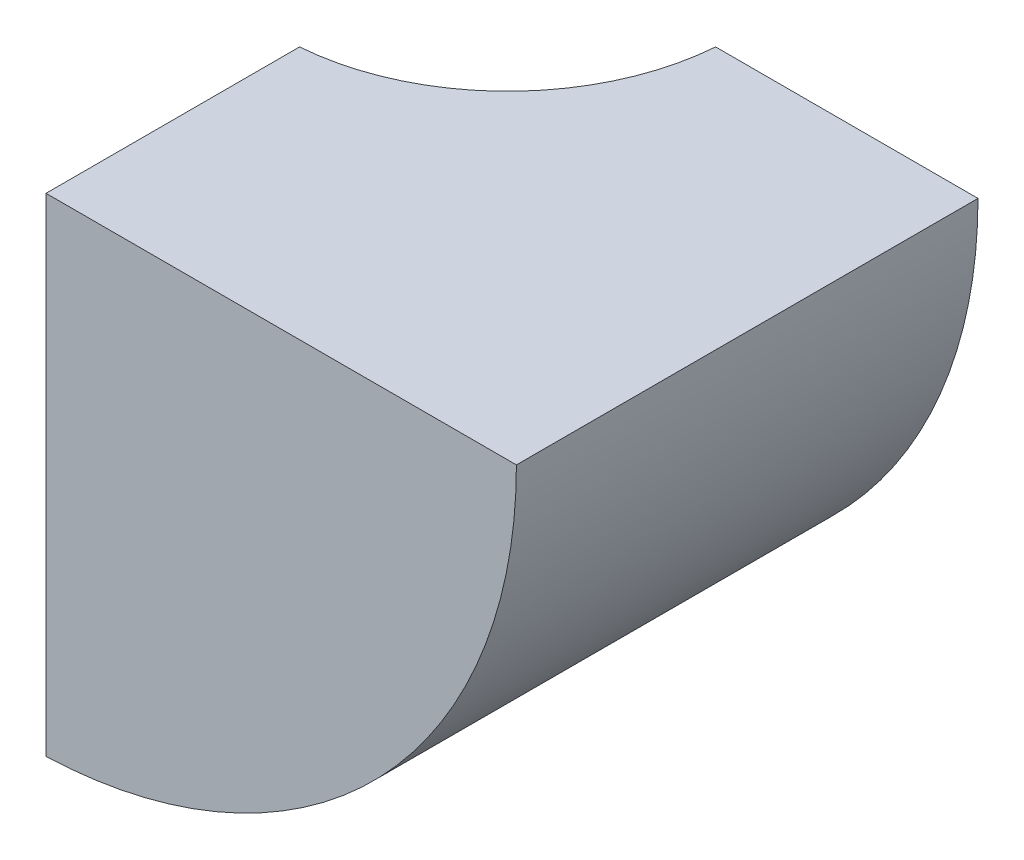
ISO-10303-21;
HEADER;
FILE_DESCRIPTION(('STEP AP214'),'2;1');
FILE_NAME('part.step','',(''),(''),'','','');
FILE_SCHEMA(('AUTOMOTIVE_DESIGN { 1 0 10303 214 1 1 1 1 }'));
ENDSEC;
DATA;
#1=APPLICATION_CONTEXT('core data for automotive mechanical design processes');
#2=APPLICATION_PROTOCOL_DEFINITION('international standard','automotive_design',2000,#1);
#3=PRODUCT_CONTEXT('',#1,'mechanical');
#4=PRODUCT('Part','Part','',(#3));
#5=PRODUCT_RELATED_PRODUCT_CATEGORY('part','',(#4));
#6=PRODUCT_DEFINITION_FORMATION('','',#4);
#7=PRODUCT_DEFINITION_CONTEXT('part definition',#1,'design');
#8=PRODUCT_DEFINITION('design','',#6,#7);
#9=PRODUCT_DEFINITION_SHAPE('','',#8);
#10=(LENGTH_UNIT() NAMED_UNIT(*) SI_UNIT(.MILLI.,.METRE.));
#11=(NAMED_UNIT(*) PLANE_ANGLE_UNIT() SI_UNIT($,.RADIAN.));
#12=(NAMED_UNIT(*) SI_UNIT($,.STERADIAN.) SOLID_ANGLE_UNIT());
#13=UNCERTAINTY_MEASURE_WITH_UNIT(LENGTH_MEASURE(1.E-05),#10,'distance_accuracy_value','');
#14=(GEOMETRIC_REPRESENTATION_CONTEXT(3) GLOBAL_UNCERTAINTY_ASSIGNED_CONTEXT((#13)) GLOBAL_UNIT_ASSIGNED_CONTEXT((#10,
#11,#12)) REPRESENTATION_CONTEXT('',''));
#15=CARTESIAN_POINT('',(0.,0.,0.));
#16=DIRECTION('',(0.,0.,1.));
#17=DIRECTION('',(1.,0.,0.));
#18=AXIS2_PLACEMENT_3D('',#15,#16,#17);
#19=CARTESIAN_POINT('',(0.,0.,16.3));
#20=DIRECTION('',(0.,0.,-1.));
#21=DIRECTION('',(-1.,0.,0.));
#22=AXIS2_PLACEMENT_3D('',#19,#20,#21);
#23=CYLINDRICAL_SURFACE('',#22,16.6);
#24=CARTESIAN_POINT('',(0.,0.,16.3));
#25=DIRECTION('',(0.,0.,1.));
#26=DIRECTION('',(1.,0.,0.));
#27=AXIS2_PLACEMENT_3D('',#24,#25,#26);
#28=CIRCLE('',#27,16.6);
#29=CARTESIAN_POINT('',(0.6,-16.5891530826622,16.3));
#30=VERTEX_POINT('',#29);
#31=CARTESIAN_POINT('',(16.6,0.,16.3));
#32=VERTEX_POINT('',#31);
#33=EDGE_CURVE('E100',#30,#32,#28,.T.);
#34=ORIENTED_EDGE('',*,*,#33,.F.);
#35=DIRECTION('',(0.,0.,-1.));
#36=VECTOR('',#35,1.);
#37=CARTESIAN_POINT('',(0.6,-16.5891530826622,16.3));
#38=LINE('',#37,#36);
#39=CARTESIAN_POINT('',(0.6,-16.5891530826622,7.6765877836445));
#40=VERTEX_POINT('',#39);
#41=EDGE_CURVE('E81',#30,#40,#38,.T.);
#42=ORIENTED_EDGE('',*,*,#41,.T.);
#43=CARTESIAN_POINT('',(0.,-16.6,7.7));
#44=CARTESIAN_POINT('',(0.205004955675874,-16.6000355256501,7.7000332979033));
#45=CARTESIAN_POINT('',(0.40999316679205,-16.5962036997198,7.69181443322823));
#46=CARTESIAN_POINT('',(0.818319103588753,-16.5810663688544,7.65912199009929));
#47=CARTESIAN_POINT('',(1.02165740191456,-16.5697635800095,7.63465431893059));
#48=CARTESIAN_POINT('',(1.42437127816107,-16.5400075408165,7.56984975397047));
#49=CARTESIAN_POINT('',(1.62375990123754,-16.5215844852279,7.52957986141088));
#50=CARTESIAN_POINT('',(2.01804716386319,-16.4780706841943,7.43361636468598));
#51=CARTESIAN_POINT('',(2.21294556047771,-16.4529795789043,7.37792192811957));
#52=CARTESIAN_POINT('',(2.59672961350476,-16.3967848767883,7.25174056967746));
#53=CARTESIAN_POINT('',(2.78562241408385,-16.3656887608985,7.18127204383945));
#54=CARTESIAN_POINT('',(3.15654283102218,-16.2982159697073,7.02614405595514));
#55=CARTESIAN_POINT('',(3.33856784584799,-16.2618373181741,6.94147928115549));
#56=CARTESIAN_POINT('',(3.87292768931245,-16.1459890438873,6.66713055424781));
#57=CARTESIAN_POINT('',(4.21358203990221,-16.0598017847908,6.45708067442543));
#58=CARTESIAN_POINT('',(4.87382680652866,-15.8723034123152,5.97591839120993));
#59=CARTESIAN_POINT('',(5.19130745424432,-15.7704290630276,5.70213512633564));
#60=CARTESIAN_POINT('',(5.63089292831427,-15.6165711535069,5.25611630854361));
#61=CARTESIAN_POINT('',(5.77139832615264,-15.5650755106644,5.10143580950454));
#62=CARTESIAN_POINT('',(6.03956569921316,-15.4629945031626,4.78092872448824));
#63=CARTESIAN_POINT('',(6.16722575818039,-15.4124092752395,4.61510048163847));
#64=CARTESIAN_POINT('',(6.41678565525146,-15.3102652704246,4.26199613828665));
#65=CARTESIAN_POINT('',(6.53776724938864,-15.2588580553448,4.07402657987702));
#66=CARTESIAN_POINT('',(6.7632985593948,-15.1602420029091,3.68752277366726));
#67=CARTESIAN_POINT('',(6.86785516284187,-15.1130314093866,3.48899300113906));
#68=CARTESIAN_POINT('',(7.05952709680409,-15.0244539434388,3.08276654125678));
#69=CARTESIAN_POINT('',(7.14666600744091,-14.9830791930922,2.87508271831012));
#70=CARTESIAN_POINT('',(7.3027335358613,-14.9076359678513,2.45172240815187));
#71=CARTESIAN_POINT('',(7.37166724434959,-14.8735654509831,2.23604817456789));
#72=CARTESIAN_POINT('',(7.4753315575324,-14.8216685182551,1.85417861946099));
#73=CARTESIAN_POINT('',(7.51430166577938,-14.8019151409353,1.68938228704231));
#74=CARTESIAN_POINT('',(7.58136307390364,-14.7676791423955,1.35707566781365));
#75=CARTESIAN_POINT('',(7.60945692013166,-14.7531952875225,1.18956602582334));
#76=CARTESIAN_POINT('',(7.65458728309474,-14.7298329619897,0.85223578994866));
#77=CARTESIAN_POINT('',(7.67159532360224,-14.7209689286056,0.682410379719938));
#78=CARTESIAN_POINT('',(7.69431310939991,-14.7090983156082,0.341727355195363));
#79=CARTESIAN_POINT('',(7.70001781292263,-14.7060943498427,0.17086931436851));
#80=CARTESIAN_POINT('',(7.7,-14.7061211745314,0.));
#81=B_SPLINE_CURVE_WITH_KNOTS('',3,(#43,#44,#45,#46,#47,#48,#49,#50,#51,#52,#53,#54,#55,#56,#57,
#58,#59,#60,#61,#62,#63,#64,#65,#66,#67,#68,#69,#70,#71,#72,#73,#74,#75,#76,#77,#78,#79,#80),
.UNSPECIFIED.,.F.,.F.,(4,2,2,2,2,2,2,2,2,2,2,2,2,2,2,2,2,2,4),(0.,0.614788155568064,
1.22935292597538,1.84133962545387,2.45335935785033,3.06462150897134,3.67611292931094,
4.89898615737778,6.18744902563375,6.83255596064479,7.47775898983411,8.16502895560217,
8.85200995106273,9.53805451499774,10.2239070372843,10.7349590732205,11.2458913891805,
11.7581310235377,12.2705990870965),.UNSPECIFIED.);
#82=CARTESIAN_POINT('',(7.6765877836445,-14.7183558864433,0.600000000000001));
#83=VERTEX_POINT('',#82);
#84=EDGE_CURVE('E104',#40,#83,#81,.T.);
#85=ORIENTED_EDGE('',*,*,#84,.T.);
#86=CARTESIAN_POINT('',(0.,0.,0.600000000000003));
#87=DIRECTION('',(0.,0.,1.));
#88=DIRECTION('',(1.,0.,0.));
#89=AXIS2_PLACEMENT_3D('',#86,#87,#88);
#90=CIRCLE('',#89,16.6);
#91=CARTESIAN_POINT('',(16.6,0.,0.6));
#92=VERTEX_POINT('',#91);
#93=EDGE_CURVE('E62',#83,#92,#90,.T.);
#94=ORIENTED_EDGE('',*,*,#93,.T.);
#95=DIRECTION('',(0.,0.,1.));
#96=VECTOR('',#95,1.);
#97=CARTESIAN_POINT('',(16.6,0.,0.));
#98=LINE('',#97,#96);
#99=EDGE_CURVE('E103',#92,#32,#98,.T.);
#100=ORIENTED_EDGE('',*,*,#99,.T.);
#101=EDGE_LOOP('',(#34,#42,#85,#94,#100));
#102=FACE_BOUND('',#101,.T.);
#103=ADVANCED_FACE('F39',(#102),#23,.T.);
#104=CARTESIAN_POINT('',(0.,0.,16.3));
#105=DIRECTION('',(0.,0.,1.));
#106=DIRECTION('',(1.,0.,0.));
#107=AXIS2_PLACEMENT_3D('',#104,#105,#106);
#108=PLANE('',#107);
#109=DIRECTION('',(0.,1.,0.));
#110=VECTOR('',#109,1.);
#111=CARTESIAN_POINT('',(0.6,-16.6,16.3));
#112=LINE('',#111,#110);
#113=CARTESIAN_POINT('',(0.6,0.,16.3));
#114=VERTEX_POINT('',#113);
#115=EDGE_CURVE('E78',#30,#114,#112,.T.);
#116=ORIENTED_EDGE('',*,*,#115,.F.);
#117=ORIENTED_EDGE('',*,*,#33,.T.);
#118=DIRECTION('',(1.,0.,0.));
#119=VECTOR('',#118,1.);
#120=CARTESIAN_POINT('',(0.,0.,16.3));
#121=LINE('',#120,#119);
#122=EDGE_CURVE('E92',#114,#32,#121,.T.);
#123=ORIENTED_EDGE('',*,*,#122,.F.);
#124=EDGE_LOOP('',(#116,#117,#123));
#125=FACE_BOUND('',#124,.T.);
#126=ADVANCED_FACE('F99',(#125),#108,.T.);
#127=CARTESIAN_POINT('',(0.,0.,0.));
#128=DIRECTION('',(0.,-1.,0.));
#129=DIRECTION('',(0.,0.,-1.));
#130=AXIS2_PLACEMENT_3D('',#127,#128,#129);
#131=PLANE('',#130);
#132=CARTESIAN_POINT('',(0.,0.,0.));
#133=DIRECTION('',(0.,1.,0.));
#134=DIRECTION('',(0.,0.,1.));
#135=AXIS2_PLACEMENT_3D('',#132,#133,#134);
#136=CIRCLE('',#135,7.7);
#137=CARTESIAN_POINT('',(0.6,0.,7.6765877836445));
#138=VERTEX_POINT('',#137);
#139=CARTESIAN_POINT('',(7.6765877836445,0.,0.600000000000001));
#140=VERTEX_POINT('',#139);
#141=EDGE_CURVE('E95',#138,#140,#136,.T.);
#142=ORIENTED_EDGE('',*,*,#141,.F.);
#143=DIRECTION('',(0.,0.,-1.));
#144=VECTOR('',#143,1.);
#145=CARTESIAN_POINT('',(0.6,0.,16.3));
#146=LINE('',#145,#144);
#147=EDGE_CURVE('E55',#114,#138,#146,.T.);
#148=ORIENTED_EDGE('',*,*,#147,.F.);
#149=ORIENTED_EDGE('',*,*,#122,.T.);
#150=ORIENTED_EDGE('',*,*,#99,.F.);
#151=DIRECTION('',(1.,0.,0.));
#152=VECTOR('',#151,1.);
#153=CARTESIAN_POINT('',(16.6,0.,0.6));
#154=LINE('',#153,#152);
#155=EDGE_CURVE('E97',#140,#92,#154,.T.);
#156=ORIENTED_EDGE('',*,*,#155,.F.);
#157=EDGE_LOOP('',(#142,#148,#149,#150,#156));
#158=FACE_BOUND('',#157,.T.);
#159=ADVANCED_FACE('F90',(#158),#131,.F.);
#160=CARTESIAN_POINT('',(0.,-16.6,0.));
#161=DIRECTION('',(0.,1.,0.));
#162=DIRECTION('',(0.,0.,1.));
#163=AXIS2_PLACEMENT_3D('',#160,#161,#162);
#164=CYLINDRICAL_SURFACE('',#163,7.7);
#165=ORIENTED_EDGE('',*,*,#84,.F.);
#166=DIRECTION('',(0.,1.,0.));
#167=VECTOR('',#166,1.);
#168=CARTESIAN_POINT('',(0.6,-16.6,7.6765877836445));
#169=LINE('',#168,#167);
#170=EDGE_CURVE('E11',#40,#138,#169,.T.);
#171=ORIENTED_EDGE('',*,*,#170,.T.);
#172=ORIENTED_EDGE('',*,*,#141,.T.);
#173=DIRECTION('',(0.,1.,0.));
#174=VECTOR('',#173,1.);
#175=CARTESIAN_POINT('',(7.6765877836445,-16.6,0.600000000000001));
#176=LINE('',#175,#174);
#177=EDGE_CURVE('E48',#140,#83,#176,.F.);
#178=ORIENTED_EDGE('',*,*,#177,.T.);
#179=EDGE_LOOP('',(#165,#171,#172,#178));
#180=FACE_BOUND('',#179,.T.);
#181=ADVANCED_FACE('F122',(#180),#164,.F.);
#182=CARTESIAN_POINT('',(16.6,-16.6,0.6));
#183=DIRECTION('',(0.,0.,1.));
#184=DIRECTION('',(1.,0.,0.));
#185=AXIS2_PLACEMENT_3D('',#182,#183,#184);
#186=PLANE('',#185);
#187=ORIENTED_EDGE('',*,*,#177,.F.);
#188=ORIENTED_EDGE('',*,*,#155,.T.);
#189=ORIENTED_EDGE('',*,*,#93,.F.);
#190=EDGE_LOOP('',(#187,#188,#189));
#191=FACE_BOUND('',#190,.T.);
#192=ADVANCED_FACE('F131',(#191),#186,.F.);
#193=CARTESIAN_POINT('',(0.6,-16.6,16.3));
#194=DIRECTION('',(1.,0.,0.));
#195=DIRECTION('',(0.,0.,-1.));
#196=AXIS2_PLACEMENT_3D('',#193,#194,#195);
#197=PLANE('',#196);
#198=ORIENTED_EDGE('',*,*,#115,.T.);
#199=ORIENTED_EDGE('',*,*,#147,.T.);
#200=ORIENTED_EDGE('',*,*,#170,.F.);
#201=ORIENTED_EDGE('',*,*,#41,.F.);
#202=EDGE_LOOP('',(#198,#199,#200,#201));
#203=FACE_BOUND('',#202,.T.);
#204=ADVANCED_FACE('F79',(#203),#197,.F.);
#205=CLOSED_SHELL('',(#103,#126,#159,#181,#192,#204));
#206=MANIFOLD_SOLID_BREP('B2',#205);
#207=ADVANCED_BREP_SHAPE_REPRESENTATION('',(#18,#206),#14);
#208=SHAPE_DEFINITION_REPRESENTATION(#9,#207);
ENDSEC;
END-ISO-10303-21;
